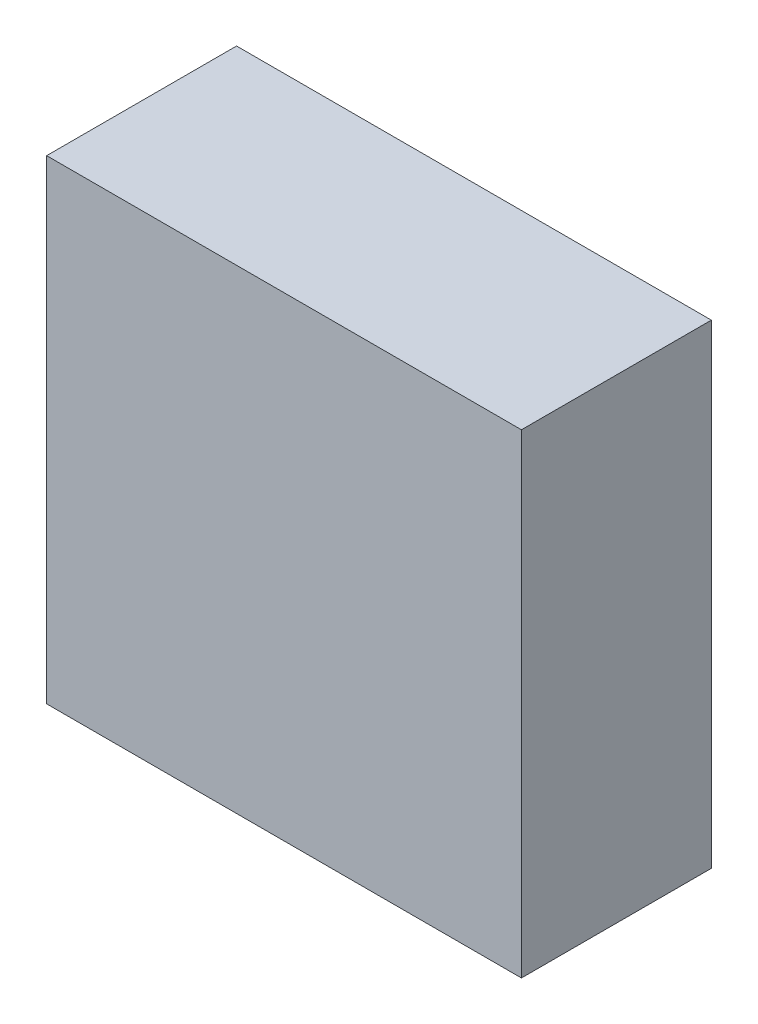
ISO-10303-21;
HEADER;
FILE_DESCRIPTION(('STEP AP214'),'2;1');
FILE_NAME('part.step','',(''),(''),'','','');
FILE_SCHEMA(('AUTOMOTIVE_DESIGN { 1 0 10303 214 1 1 1 1 }'));
ENDSEC;
DATA;
#1=APPLICATION_CONTEXT('core data for automotive mechanical design processes');
#2=APPLICATION_PROTOCOL_DEFINITION('international standard','automotive_design',2000,#1);
#3=PRODUCT_CONTEXT('',#1,'mechanical');
#4=PRODUCT('Part','Part','',(#3));
#5=PRODUCT_RELATED_PRODUCT_CATEGORY('part','',(#4));
#6=PRODUCT_DEFINITION_FORMATION('','',#4);
#7=PRODUCT_DEFINITION_CONTEXT('part definition',#1,'design');
#8=PRODUCT_DEFINITION('design','',#6,#7);
#9=PRODUCT_DEFINITION_SHAPE('','',#8);
#10=(LENGTH_UNIT() NAMED_UNIT(*) SI_UNIT(.MILLI.,.METRE.));
#11=(NAMED_UNIT(*) PLANE_ANGLE_UNIT() SI_UNIT($,.RADIAN.));
#12=(NAMED_UNIT(*) SI_UNIT($,.STERADIAN.) SOLID_ANGLE_UNIT());
#13=UNCERTAINTY_MEASURE_WITH_UNIT(LENGTH_MEASURE(1.E-05),#10,'distance_accuracy_value','');
#14=(GEOMETRIC_REPRESENTATION_CONTEXT(3) GLOBAL_UNCERTAINTY_ASSIGNED_CONTEXT((#13)) GLOBAL_UNIT_ASSIGNED_CONTEXT((#10,
#11,#12)) REPRESENTATION_CONTEXT('',''));
#15=CARTESIAN_POINT('',(0.,0.,0.));
#16=DIRECTION('',(0.,0.,1.));
#17=DIRECTION('',(1.,0.,0.));
#18=AXIS2_PLACEMENT_3D('',#15,#16,#17);
#19=CARTESIAN_POINT('',(25.,-25.,20.));
#20=DIRECTION('',(-1.,0.,0.));
#21=DIRECTION('',(0.,0.,1.));
#22=AXIS2_PLACEMENT_3D('',#19,#20,#21);
#23=PLANE('',#22);
#24=DIRECTION('',(0.,1.,0.));
#25=VECTOR('',#24,1.);
#26=CARTESIAN_POINT('',(25.,-25.,0.));
#27=LINE('',#26,#25);
#28=CARTESIAN_POINT('',(25.,-25.,0.));
#29=VERTEX_POINT('',#28);
#30=CARTESIAN_POINT('',(25.,25.,0.));
#31=VERTEX_POINT('',#30);
#32=EDGE_CURVE('E113',#29,#31,#27,.T.);
#33=ORIENTED_EDGE('',*,*,#32,.T.);
#34=DIRECTION('',(0.,0.,-1.));
#35=VECTOR('',#34,1.);
#36=CARTESIAN_POINT('',(25.,25.,20.));
#37=LINE('',#36,#35);
#38=CARTESIAN_POINT('',(25.,25.,20.));
#39=VERTEX_POINT('',#38);
#40=EDGE_CURVE('E11',#39,#31,#37,.T.);
#41=ORIENTED_EDGE('',*,*,#40,.F.);
#42=DIRECTION('',(0.,1.,0.));
#43=VECTOR('',#42,1.);
#44=CARTESIAN_POINT('',(25.,-25.,20.));
#45=LINE('',#44,#43);
#46=CARTESIAN_POINT('',(25.,-25.,20.));
#47=VERTEX_POINT('',#46);
#48=EDGE_CURVE('E97',#47,#39,#45,.T.);
#49=ORIENTED_EDGE('',*,*,#48,.F.);
#50=DIRECTION('',(0.,0.,-1.));
#51=VECTOR('',#50,1.);
#52=CARTESIAN_POINT('',(25.,-25.,20.));
#53=LINE('',#52,#51);
#54=EDGE_CURVE('E109',#47,#29,#53,.T.);
#55=ORIENTED_EDGE('',*,*,#54,.T.);
#56=EDGE_LOOP('',(#33,#41,#49,#55));
#57=FACE_BOUND('',#56,.T.);
#58=ADVANCED_FACE('F45',(#57),#23,.F.);
#59=CARTESIAN_POINT('',(-25.,25.,20.));
#60=DIRECTION('',(0.,-1.,0.));
#61=DIRECTION('',(0.,0.,-1.));
#62=AXIS2_PLACEMENT_3D('',#59,#60,#61);
#63=PLANE('',#62);
#64=DIRECTION('',(-1.,0.,0.));
#65=VECTOR('',#64,1.);
#66=CARTESIAN_POINT('',(-25.,25.,0.));
#67=LINE('',#66,#65);
#68=CARTESIAN_POINT('',(-25.,25.,0.));
#69=VERTEX_POINT('',#68);
#70=EDGE_CURVE('E102',#31,#69,#67,.T.);
#71=ORIENTED_EDGE('',*,*,#70,.T.);
#72=DIRECTION('',(0.,0.,-1.));
#73=VECTOR('',#72,1.);
#74=CARTESIAN_POINT('',(-25.,25.,20.));
#75=LINE('',#74,#73);
#76=CARTESIAN_POINT('',(-25.,25.,20.));
#77=VERTEX_POINT('',#76);
#78=EDGE_CURVE('E54',#77,#69,#75,.T.);
#79=ORIENTED_EDGE('',*,*,#78,.F.);
#80=DIRECTION('',(-1.,0.,0.));
#81=VECTOR('',#80,1.);
#82=CARTESIAN_POINT('',(-25.,25.,20.));
#83=LINE('',#82,#81);
#84=EDGE_CURVE('E92',#39,#77,#83,.T.);
#85=ORIENTED_EDGE('',*,*,#84,.F.);
#86=ORIENTED_EDGE('',*,*,#40,.T.);
#87=EDGE_LOOP('',(#71,#79,#85,#86));
#88=FACE_BOUND('',#87,.T.);
#89=ADVANCED_FACE('F101',(#88),#63,.F.);
#90=CARTESIAN_POINT('',(-25.,-25.,20.));
#91=DIRECTION('',(1.,0.,0.));
#92=DIRECTION('',(0.,0.,-1.));
#93=AXIS2_PLACEMENT_3D('',#90,#91,#92);
#94=PLANE('',#93);
#95=DIRECTION('',(0.,-1.,0.));
#96=VECTOR('',#95,1.);
#97=CARTESIAN_POINT('',(-25.,-25.,0.));
#98=LINE('',#97,#96);
#99=CARTESIAN_POINT('',(-25.,-25.,0.));
#100=VERTEX_POINT('',#99);
#101=EDGE_CURVE('E79',#69,#100,#98,.T.);
#102=ORIENTED_EDGE('',*,*,#101,.T.);
#103=DIRECTION('',(0.,0.,-1.));
#104=VECTOR('',#103,1.);
#105=CARTESIAN_POINT('',(-25.,-25.,20.));
#106=LINE('',#105,#104);
#107=CARTESIAN_POINT('',(-25.,-25.,20.));
#108=VERTEX_POINT('',#107);
#109=EDGE_CURVE('E104',#108,#100,#106,.T.);
#110=ORIENTED_EDGE('',*,*,#109,.F.);
#111=DIRECTION('',(0.,-1.,0.));
#112=VECTOR('',#111,1.);
#113=CARTESIAN_POINT('',(-25.,-25.,20.));
#114=LINE('',#113,#112);
#115=EDGE_CURVE('E95',#77,#108,#114,.T.);
#116=ORIENTED_EDGE('',*,*,#115,.F.);
#117=ORIENTED_EDGE('',*,*,#78,.T.);
#118=EDGE_LOOP('',(#102,#110,#116,#117));
#119=FACE_BOUND('',#118,.T.);
#120=ADVANCED_FACE('F105',(#119),#94,.F.);
#121=CARTESIAN_POINT('',(-25.,-25.,20.));
#122=DIRECTION('',(0.,1.,0.));
#123=DIRECTION('',(0.,0.,1.));
#124=AXIS2_PLACEMENT_3D('',#121,#122,#123);
#125=PLANE('',#124);
#126=DIRECTION('',(1.,0.,0.));
#127=VECTOR('',#126,1.);
#128=CARTESIAN_POINT('',(-25.,-25.,0.));
#129=LINE('',#128,#127);
#130=EDGE_CURVE('E85',#100,#29,#129,.T.);
#131=ORIENTED_EDGE('',*,*,#130,.T.);
#132=ORIENTED_EDGE('',*,*,#54,.F.);
#133=DIRECTION('',(1.,0.,0.));
#134=VECTOR('',#133,1.);
#135=CARTESIAN_POINT('',(-25.,-25.,20.));
#136=LINE('',#135,#134);
#137=EDGE_CURVE('E62',#108,#47,#136,.T.);
#138=ORIENTED_EDGE('',*,*,#137,.F.);
#139=ORIENTED_EDGE('',*,*,#109,.T.);
#140=EDGE_LOOP('',(#131,#132,#138,#139));
#141=FACE_BOUND('',#140,.T.);
#142=ADVANCED_FACE('F126',(#141),#125,.F.);
#143=CARTESIAN_POINT('',(0.,0.,20.));
#144=DIRECTION('',(0.,0.,-1.));
#145=DIRECTION('',(-1.,0.,0.));
#146=AXIS2_PLACEMENT_3D('',#143,#144,#145);
#147=PLANE('',#146);
#148=ORIENTED_EDGE('',*,*,#48,.T.);
#149=ORIENTED_EDGE('',*,*,#84,.T.);
#150=ORIENTED_EDGE('',*,*,#115,.T.);
#151=ORIENTED_EDGE('',*,*,#137,.T.);
#152=EDGE_LOOP('',(#148,#149,#150,#151));
#153=FACE_BOUND('',#152,.T.);
#154=ADVANCED_FACE('F93',(#153),#147,.F.);
#155=CARTESIAN_POINT('',(0.,0.,0.));
#156=DIRECTION('',(0.,0.,-1.));
#157=DIRECTION('',(-1.,0.,0.));
#158=AXIS2_PLACEMENT_3D('',#155,#156,#157);
#159=PLANE('',#158);
#160=ORIENTED_EDGE('',*,*,#32,.F.);
#161=ORIENTED_EDGE('',*,*,#130,.F.);
#162=ORIENTED_EDGE('',*,*,#101,.F.);
#163=ORIENTED_EDGE('',*,*,#70,.F.);
#164=EDGE_LOOP('',(#160,#161,#162,#163));
#165=FACE_BOUND('',#164,.T.);
#166=ADVANCED_FACE('F129',(#165),#159,.T.);
#167=CLOSED_SHELL('',(#58,#89,#120,#142,#154,#166));
#168=MANIFOLD_SOLID_BREP('B2',#167);
#169=ADVANCED_BREP_SHAPE_REPRESENTATION('',(#18,#168),#14);
#170=SHAPE_DEFINITION_REPRESENTATION(#9,#169);
ENDSEC;
END-ISO-10303-21;
